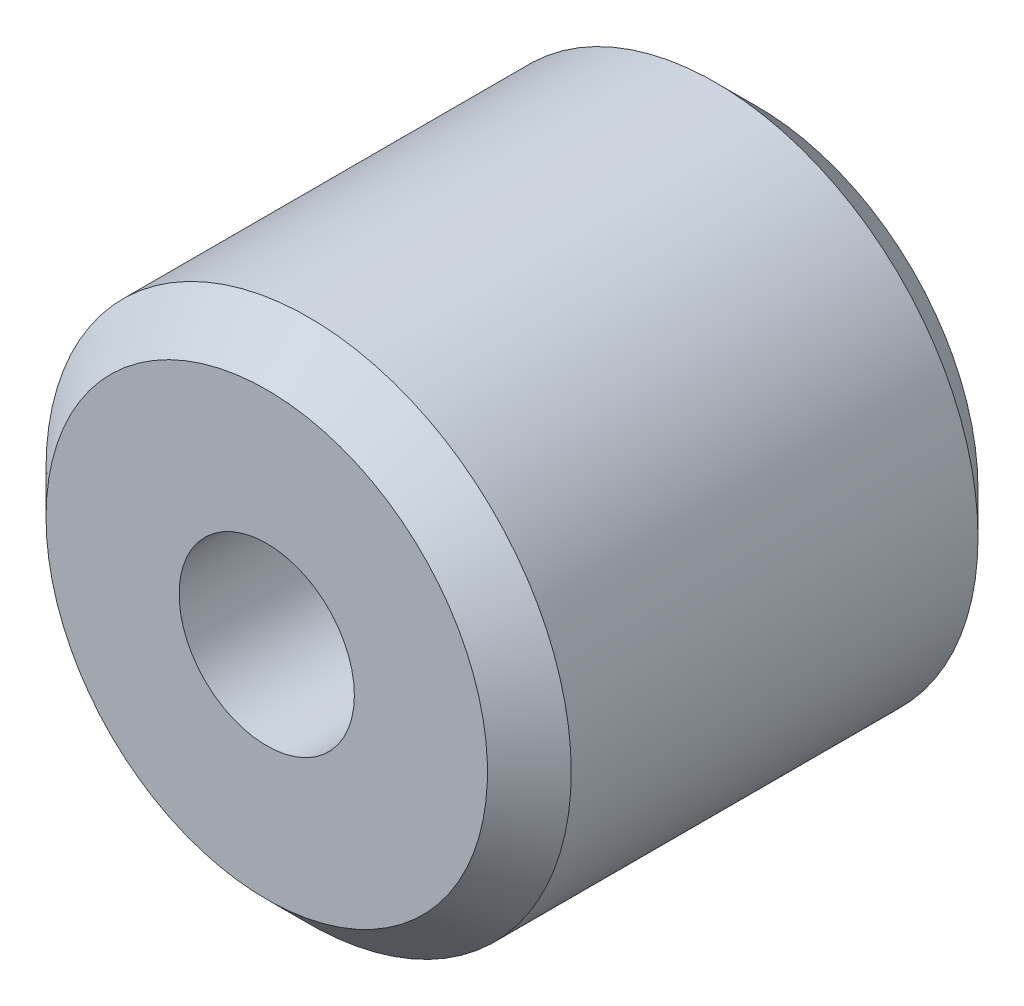
ISO-10303-21;
HEADER;
FILE_DESCRIPTION(('STEP AP214'),'2;1');
FILE_NAME('part.step','',(''),(''),'','','');
FILE_SCHEMA(('AUTOMOTIVE_DESIGN { 1 0 10303 214 1 1 1 1 }'));
ENDSEC;
DATA;
#1=APPLICATION_CONTEXT('core data for automotive mechanical design processes');
#2=APPLICATION_PROTOCOL_DEFINITION('international standard','automotive_design',2000,#1);
#3=PRODUCT_CONTEXT('',#1,'mechanical');
#4=PRODUCT('Part','Part','',(#3));
#5=PRODUCT_RELATED_PRODUCT_CATEGORY('part','',(#4));
#6=PRODUCT_DEFINITION_FORMATION('','',#4);
#7=PRODUCT_DEFINITION_CONTEXT('part definition',#1,'design');
#8=PRODUCT_DEFINITION('design','',#6,#7);
#9=PRODUCT_DEFINITION_SHAPE('','',#8);
#10=(LENGTH_UNIT() NAMED_UNIT(*) SI_UNIT(.MILLI.,.METRE.));
#11=(NAMED_UNIT(*) PLANE_ANGLE_UNIT() SI_UNIT($,.RADIAN.));
#12=(NAMED_UNIT(*) SI_UNIT($,.STERADIAN.) SOLID_ANGLE_UNIT());
#13=UNCERTAINTY_MEASURE_WITH_UNIT(LENGTH_MEASURE(1.E-05),#10,'distance_accuracy_value','');
#14=(GEOMETRIC_REPRESENTATION_CONTEXT(3) GLOBAL_UNCERTAINTY_ASSIGNED_CONTEXT((#13)) GLOBAL_UNIT_ASSIGNED_CONTEXT((#10,
#11,#12)) REPRESENTATION_CONTEXT('',''));
#15=CARTESIAN_POINT('',(0.,0.,0.));
#16=DIRECTION('',(0.,0.,1.));
#17=DIRECTION('',(1.,0.,0.));
#18=AXIS2_PLACEMENT_3D('',#15,#16,#17);
#19=CARTESIAN_POINT('',(0.,0.,4.45));
#20=DIRECTION('',(0.,0.,1.));
#21=DIRECTION('',(1.,0.,0.));
#22=AXIS2_PLACEMENT_3D('',#19,#20,#21);
#23=PLANE('',#22);
#24=CARTESIAN_POINT('',(0.,0.,4.45));
#25=DIRECTION('',(0.,0.,1.));
#26=DIRECTION('',(1.,0.,0.));
#27=AXIS2_PLACEMENT_3D('',#24,#25,#26);
#28=CIRCLE('',#27,4.005);
#29=CARTESIAN_POINT('',(-4.005,0.,4.45));
#30=VERTEX_POINT('',#29);
#31=EDGE_CURVE('E10',#30,#30,#28,.T.);
#32=ORIENTED_EDGE('',*,*,#31,.T.);
#33=EDGE_LOOP('',(#32));
#34=FACE_BOUND('',#33,.T.);
#35=CARTESIAN_POINT('',(0.,0.,4.45));
#36=DIRECTION('',(0.,0.,1.));
#37=DIRECTION('',(1.,0.,0.));
#38=AXIS2_PLACEMENT_3D('',#35,#36,#37);
#39=CIRCLE('',#38,1.59);
#40=CARTESIAN_POINT('',(1.59,0.,4.45));
#41=VERTEX_POINT('',#40);
#42=EDGE_CURVE('E54',#41,#41,#39,.T.);
#43=ORIENTED_EDGE('',*,*,#42,.F.);
#44=EDGE_LOOP('',(#43));
#45=FACE_BOUND('',#44,.T.);
#46=ADVANCED_FACE('F33',(#34,#45),#23,.T.);
#47=CARTESIAN_POINT('',(0.,0.,-4.45));
#48=DIRECTION('',(0.,0.,1.));
#49=DIRECTION('',(1.,0.,0.));
#50=AXIS2_PLACEMENT_3D('',#47,#48,#49);
#51=PLANE('',#50);
#52=CARTESIAN_POINT('',(0.,0.,-4.45));
#53=DIRECTION('',(0.,0.,1.));
#54=DIRECTION('',(1.,0.,0.));
#55=AXIS2_PLACEMENT_3D('',#52,#53,#54);
#56=CIRCLE('',#55,4.00499999999999);
#57=CARTESIAN_POINT('',(4.00499999999999,0.,-4.45));
#58=VERTEX_POINT('',#57);
#59=EDGE_CURVE('E41',#58,#58,#56,.F.);
#60=ORIENTED_EDGE('',*,*,#59,.T.);
#61=EDGE_LOOP('',(#60));
#62=FACE_BOUND('',#61,.T.);
#63=CARTESIAN_POINT('',(0.,0.,-4.45));
#64=DIRECTION('',(0.,0.,1.));
#65=DIRECTION('',(1.,0.,0.));
#66=AXIS2_PLACEMENT_3D('',#63,#64,#65);
#67=CIRCLE('',#66,1.59);
#68=CARTESIAN_POINT('',(1.59,0.,-4.45));
#69=VERTEX_POINT('',#68);
#70=EDGE_CURVE('E55',#69,#69,#67,.T.);
#71=ORIENTED_EDGE('',*,*,#70,.T.);
#72=EDGE_LOOP('',(#71));
#73=FACE_BOUND('',#72,.T.);
#74=ADVANCED_FACE('F65',(#62,#73),#51,.F.);
#75=CARTESIAN_POINT('',(0.,0.,4.45));
#76=DIRECTION('',(0.,0.,-1.));
#77=DIRECTION('',(-1.,0.,0.));
#78=AXIS2_PLACEMENT_3D('',#75,#76,#77);
#79=CYLINDRICAL_SURFACE('',#78,4.765);
#80=CARTESIAN_POINT('',(0.,0.,-3.69));
#81=DIRECTION('',(0.,0.,1.));
#82=DIRECTION('',(1.,0.,0.));
#83=AXIS2_PLACEMENT_3D('',#80,#81,#82);
#84=CIRCLE('',#83,4.765);
#85=CARTESIAN_POINT('',(-4.765,0.,-3.69));
#86=VERTEX_POINT('',#85);
#87=EDGE_CURVE('E45',#86,#86,#84,.T.);
#88=CARTESIAN_POINT('',(0.,0.,3.69));
#89=DIRECTION('',(0.,0.,1.));
#90=DIRECTION('',(1.,0.,0.));
#91=AXIS2_PLACEMENT_3D('',#88,#89,#90);
#92=CIRCLE('',#91,4.765);
#93=CARTESIAN_POINT('',(-4.765,0.,3.69));
#94=VERTEX_POINT('',#93);
#95=EDGE_CURVE('E49',#94,#94,#92,.F.);
#96=CARTESIAN_POINT('',(-4.765,0.,-3.69));
#97=CARTESIAN_POINT('',(-4.765,0.,-3.613125));
#98=CARTESIAN_POINT('',(-4.765,0.,-3.53625));
#99=CARTESIAN_POINT('',(-4.765,0.,-3.3825));
#100=CARTESIAN_POINT('',(-4.765,0.,-3.305625));
#101=CARTESIAN_POINT('',(-4.765,0.,-3.151875));
#102=CARTESIAN_POINT('',(-4.765,0.,-3.075));
#103=CARTESIAN_POINT('',(-4.765,0.,-2.92125));
#104=CARTESIAN_POINT('',(-4.765,0.,-2.844375));
#105=CARTESIAN_POINT('',(-4.765,0.,-2.690625));
#106=CARTESIAN_POINT('',(-4.765,0.,-2.61375));
#107=CARTESIAN_POINT('',(-4.765,0.,-2.46));
#108=CARTESIAN_POINT('',(-4.765,0.,-2.383125));
#109=CARTESIAN_POINT('',(-4.765,0.,-2.229375));
#110=CARTESIAN_POINT('',(-4.765,0.,-2.1525));
#111=CARTESIAN_POINT('',(-4.765,0.,-1.99875));
#112=CARTESIAN_POINT('',(-4.765,0.,-1.921875));
#113=CARTESIAN_POINT('',(-4.765,0.,-1.768125));
#114=CARTESIAN_POINT('',(-4.765,0.,-1.69125));
#115=CARTESIAN_POINT('',(-4.765,0.,-1.5375));
#116=CARTESIAN_POINT('',(-4.765,0.,-1.460625));
#117=CARTESIAN_POINT('',(-4.765,0.,-1.306875));
#118=CARTESIAN_POINT('',(-4.765,0.,-1.23));
#119=CARTESIAN_POINT('',(-4.765,0.,-1.07625));
#120=CARTESIAN_POINT('',(-4.765,0.,-0.999374999999999));
#121=CARTESIAN_POINT('',(-4.765,0.,-0.845625));
#122=CARTESIAN_POINT('',(-4.765,0.,-0.76875));
#123=CARTESIAN_POINT('',(-4.765,0.,-0.615));
#124=CARTESIAN_POINT('',(-4.765,0.,-0.538125));
#125=CARTESIAN_POINT('',(-4.765,0.,-0.384375));
#126=CARTESIAN_POINT('',(-4.765,0.,-0.3075));
#127=CARTESIAN_POINT('',(-4.765,0.,-0.15375));
#128=CARTESIAN_POINT('',(-4.765,0.,-0.076875));
#129=CARTESIAN_POINT('',(-4.765,0.,0.076875));
#130=CARTESIAN_POINT('',(-4.765,0.,0.15375));
#131=CARTESIAN_POINT('',(-4.765,0.,0.3075));
#132=CARTESIAN_POINT('',(-4.765,0.,0.384375));
#133=CARTESIAN_POINT('',(-4.765,0.,0.538125));
#134=CARTESIAN_POINT('',(-4.765,0.,0.615));
#135=CARTESIAN_POINT('',(-4.765,0.,0.76875));
#136=CARTESIAN_POINT('',(-4.765,0.,0.845625));
#137=CARTESIAN_POINT('',(-4.765,0.,0.999375));
#138=CARTESIAN_POINT('',(-4.765,0.,1.07625));
#139=CARTESIAN_POINT('',(-4.765,0.,1.23));
#140=CARTESIAN_POINT('',(-4.765,0.,1.306875));
#141=CARTESIAN_POINT('',(-4.765,0.,1.460625));
#142=CARTESIAN_POINT('',(-4.765,0.,1.5375));
#143=CARTESIAN_POINT('',(-4.765,0.,1.69125));
#144=CARTESIAN_POINT('',(-4.765,0.,1.768125));
#145=CARTESIAN_POINT('',(-4.765,0.,1.921875));
#146=CARTESIAN_POINT('',(-4.765,0.,1.99875));
#147=CARTESIAN_POINT('',(-4.765,0.,2.1525));
#148=CARTESIAN_POINT('',(-4.765,0.,2.229375));
#149=CARTESIAN_POINT('',(-4.765,0.,2.383125));
#150=CARTESIAN_POINT('',(-4.765,0.,2.46));
#151=CARTESIAN_POINT('',(-4.765,0.,2.61375));
#152=CARTESIAN_POINT('',(-4.765,0.,2.690625));
#153=CARTESIAN_POINT('',(-4.765,0.,2.844375));
#154=CARTESIAN_POINT('',(-4.765,0.,2.92125));
#155=CARTESIAN_POINT('',(-4.765,0.,3.075));
#156=CARTESIAN_POINT('',(-4.765,0.,3.151875));
#157=CARTESIAN_POINT('',(-4.765,0.,3.305625));
#158=CARTESIAN_POINT('',(-4.765,0.,3.3825));
#159=CARTESIAN_POINT('',(-4.765,0.,3.53625));
#160=CARTESIAN_POINT('',(-4.765,0.,3.613125));
#161=CARTESIAN_POINT('',(-4.765,0.,3.69));
#162=B_SPLINE_CURVE_WITH_KNOTS('',3,(#96,#97,#98,#99,#100,#101,#102,#103,#104,#105,#106,#107,
#108,#109,#110,#111,#112,#113,#114,#115,#116,#117,#118,#119,#120,#121,#122,#123,#124,#125,#126,
#127,#128,#129,#130,#131,#132,#133,#134,#135,#136,#137,#138,#139,#140,#141,#142,#143,#144,#145,
#146,#147,#148,#149,#150,#151,#152,#153,#154,#155,#156,#157,#158,#159,#160,#161),.UNSPECIFIED.,
.F.,.F.,(4,2,2,2,2,2,2,2,2,2,2,2,2,2,2,2,2,2,2,2,2,2,2,2,2,2,2,2,2,2,2,2,4),(0.,0.230625,
0.46125,0.691875,0.9225,1.153125,1.38375,1.614375,1.845,2.075625,2.30625,2.536875,2.7675,
2.998125,3.22875,3.459375,3.69,3.920625,4.15125,4.381875,4.6125,4.843125,5.07375,5.304375,5.535,
5.765625,5.99625,6.226875,6.4575,6.688125,6.91875,7.149375,7.38),.UNSPECIFIED.);
#163=EDGE_CURVE('BSEAM70',#86,#94,#162,.T.);
#164=ORIENTED_EDGE('',*,*,#87,.T.);
#165=ORIENTED_EDGE('',*,*,#95,.T.);
#166=ORIENTED_EDGE('',*,*,#163,.T.);
#167=ORIENTED_EDGE('',*,*,#163,.F.);
#168=EDGE_LOOP('',(#164,#166,#165,#167));
#169=FACE_BOUND('',#168,.T.);
#170=ADVANCED_FACE('F70',(#169),#79,.T.);
#171=CARTESIAN_POINT('',(0.,0.,4.45));
#172=DIRECTION('',(0.,0.,-1.));
#173=DIRECTION('',(-1.,0.,0.));
#174=AXIS2_PLACEMENT_3D('',#171,#172,#173);
#175=CYLINDRICAL_SURFACE('',#174,1.59);
#176=ORIENTED_EDGE('',*,*,#42,.T.);
#177=EDGE_LOOP('',(#176));
#178=FACE_BOUND('',#177,.T.);
#179=ORIENTED_EDGE('',*,*,#70,.F.);
#180=EDGE_LOOP('',(#179));
#181=FACE_BOUND('',#180,.T.);
#182=ADVANCED_FACE('F61',(#178,#181),#175,.F.);
#183=CARTESIAN_POINT('',(0.,0.,-3.69));
#184=DIRECTION('',(0.,0.,1.));
#185=DIRECTION('',(1.,0.,0.));
#186=AXIS2_PLACEMENT_3D('',#183,#184,#185);
#187=CONICAL_SURFACE('',#186,4.765,0.785398163397451);
#188=ORIENTED_EDGE('',*,*,#59,.F.);
#189=EDGE_LOOP('',(#188));
#190=FACE_BOUND('',#189,.T.);
#191=ORIENTED_EDGE('',*,*,#87,.F.);
#192=EDGE_LOOP('',(#191));
#193=FACE_BOUND('',#192,.T.);
#194=ADVANCED_FACE('F77',(#190,#193),#187,.T.);
#195=CARTESIAN_POINT('',(0.,0.,4.45));
#196=DIRECTION('',(0.,0.,-1.));
#197=DIRECTION('',(-1.,0.,0.));
#198=AXIS2_PLACEMENT_3D('',#195,#196,#197);
#199=CONICAL_SURFACE('',#198,4.005,0.785398163397447);
#200=CARTESIAN_POINT('',(-4.765,0.,3.69));
#201=CARTESIAN_POINT('',(-4.75708333333333,0.,3.69791666666666));
#202=CARTESIAN_POINT('',(-4.74916666666667,0.,3.70583333333333));
#203=CARTESIAN_POINT('',(-4.73333333333333,0.,3.72166666666666));
#204=CARTESIAN_POINT('',(-4.72541666666667,0.,3.72958333333333));
#205=CARTESIAN_POINT('',(-4.70958333333333,0.,3.74541666666666));
#206=CARTESIAN_POINT('',(-4.70166666666667,0.,3.75333333333333));
#207=CARTESIAN_POINT('',(-4.68583333333333,0.,3.76916666666666));
#208=CARTESIAN_POINT('',(-4.67791666666667,0.,3.77708333333333));
#209=CARTESIAN_POINT('',(-4.66208333333333,0.,3.79291666666666));
#210=CARTESIAN_POINT('',(-4.65416666666667,0.,3.80083333333333));
#211=CARTESIAN_POINT('',(-4.63833333333333,0.,3.81666666666666));
#212=CARTESIAN_POINT('',(-4.63041666666667,0.,3.82458333333333));
#213=CARTESIAN_POINT('',(-4.61458333333333,0.,3.84041666666667));
#214=CARTESIAN_POINT('',(-4.60666666666667,0.,3.84833333333333));
#215=CARTESIAN_POINT('',(-4.59083333333333,0.,3.86416666666666));
#216=CARTESIAN_POINT('',(-4.58291666666667,0.,3.87208333333333));
#217=CARTESIAN_POINT('',(-4.56708333333333,0.,3.88791666666667));
#218=CARTESIAN_POINT('',(-4.55916666666667,0.,3.89583333333333));
#219=CARTESIAN_POINT('',(-4.54333333333333,0.,3.91166666666666));
#220=CARTESIAN_POINT('',(-4.53541666666666,0.,3.91958333333333));
#221=CARTESIAN_POINT('',(-4.51958333333333,0.,3.93541666666667));
#222=CARTESIAN_POINT('',(-4.51166666666667,0.,3.94333333333333));
#223=CARTESIAN_POINT('',(-4.49583333333333,0.,3.95916666666666));
#224=CARTESIAN_POINT('',(-4.48791666666667,0.,3.96708333333333));
#225=CARTESIAN_POINT('',(-4.47208333333333,0.,3.98291666666666));
#226=CARTESIAN_POINT('',(-4.46416666666666,0.,3.99083333333333));
#227=CARTESIAN_POINT('',(-4.44833333333333,0.,4.00666666666667));
#228=CARTESIAN_POINT('',(-4.44041666666667,0.,4.01458333333333));
#229=CARTESIAN_POINT('',(-4.42458333333333,0.,4.03041666666666));
#230=CARTESIAN_POINT('',(-4.41666666666667,0.,4.03833333333333));
#231=CARTESIAN_POINT('',(-4.40083333333333,0.,4.05416666666667));
#232=CARTESIAN_POINT('',(-4.39291666666666,0.,4.06208333333333));
#233=CARTESIAN_POINT('',(-4.37708333333333,0.,4.07791666666667));
#234=CARTESIAN_POINT('',(-4.36916666666666,0.,4.08583333333333));
#235=CARTESIAN_POINT('',(-4.35333333333333,0.,4.10166666666666));
#236=CARTESIAN_POINT('',(-4.34541666666667,0.,4.10958333333333));
#237=CARTESIAN_POINT('',(-4.32958333333333,0.,4.12541666666667));
#238=CARTESIAN_POINT('',(-4.32166666666667,0.,4.13333333333333));
#239=CARTESIAN_POINT('',(-4.30583333333333,0.,4.14916666666667));
#240=CARTESIAN_POINT('',(-4.29791666666666,0.,4.15708333333333));
#241=CARTESIAN_POINT('',(-4.28208333333333,0.,4.17291666666666));
#242=CARTESIAN_POINT('',(-4.27416666666667,0.,4.18083333333333));
#243=CARTESIAN_POINT('',(-4.25833333333333,0.,4.19666666666667));
#244=CARTESIAN_POINT('',(-4.25041666666667,0.,4.20458333333333));
#245=CARTESIAN_POINT('',(-4.23458333333333,0.,4.22041666666667));
#246=CARTESIAN_POINT('',(-4.22666666666666,0.,4.22833333333333));
#247=CARTESIAN_POINT('',(-4.21083333333333,0.,4.24416666666666));
#248=CARTESIAN_POINT('',(-4.20291666666667,0.,4.25208333333333));
#249=CARTESIAN_POINT('',(-4.18708333333333,0.,4.26791666666667));
#250=CARTESIAN_POINT('',(-4.17916666666667,0.,4.27583333333333));
#251=CARTESIAN_POINT('',(-4.16333333333333,0.,4.29166666666667));
#252=CARTESIAN_POINT('',(-4.15541666666666,0.,4.29958333333333));
#253=CARTESIAN_POINT('',(-4.13958333333333,0.,4.31541666666666));
#254=CARTESIAN_POINT('',(-4.13166666666667,0.,4.32333333333333));
#255=CARTESIAN_POINT('',(-4.11583333333333,0.,4.33916666666667));
#256=CARTESIAN_POINT('',(-4.10791666666667,0.,4.34708333333333));
#257=CARTESIAN_POINT('',(-4.09208333333333,0.,4.36291666666667));
#258=CARTESIAN_POINT('',(-4.08416666666666,0.,4.37083333333333));
#259=CARTESIAN_POINT('',(-4.06833333333333,0.,4.38666666666667));
#260=CARTESIAN_POINT('',(-4.06041666666667,0.,4.39458333333333));
#261=CARTESIAN_POINT('',(-4.04458333333333,0.,4.41041666666667));
#262=CARTESIAN_POINT('',(-4.03666666666667,0.,4.41833333333333));
#263=CARTESIAN_POINT('',(-4.02083333333333,0.,4.43416666666667));
#264=CARTESIAN_POINT('',(-4.01291666666666,0.,4.44208333333333));
#265=CARTESIAN_POINT('',(-4.005,0.,4.45));
#266=B_SPLINE_CURVE_WITH_KNOTS('',3,(#200,#201,#202,#203,#204,#205,#206,#207,#208,#209,#210,
#211,#212,#213,#214,#215,#216,#217,#218,#219,#220,#221,#222,#223,#224,#225,#226,#227,#228,#229,
#230,#231,#232,#233,#234,#235,#236,#237,#238,#239,#240,#241,#242,#243,#244,#245,#246,#247,#248,
#249,#250,#251,#252,#253,#254,#255,#256,#257,#258,#259,#260,#261,#262,#263,#264,#265),
.UNSPECIFIED.,.F.,.F.,(4,2,2,2,2,2,2,2,2,2,2,2,2,2,2,2,2,2,2,2,2,2,2,2,2,2,2,2,2,2,2,2,4),(0.,
0.0335875721063609,0.067175144212722,0.100762716319083,0.134350288425444,0.167937860531805,
0.201525432638166,0.235113004744527,0.268700576850888,0.302288148957249,0.335875721063611,
0.369463293169971,0.403050865276333,0.436638437382694,0.470226009489054,0.503813581595416,
0.537401153701777,0.570988725808138,0.604576297914499,0.63816387002086,0.671751442127221,
0.705339014233582,0.738926586339943,0.772514158446304,0.806101730552665,0.839689302659026,
0.873276874765387,0.906864446871748,0.940452018978109,0.974039591084471,1.00762716319083,
1.04121473529719,1.07480230740355),.UNSPECIFIED.);
#267=EDGE_CURVE('BSEAM36',#94,#30,#266,.T.);
#268=ORIENTED_EDGE('',*,*,#95,.F.);
#269=ORIENTED_EDGE('',*,*,#31,.F.);
#270=ORIENTED_EDGE('',*,*,#267,.T.);
#271=ORIENTED_EDGE('',*,*,#267,.F.);
#272=EDGE_LOOP('',(#268,#270,#269,#271));
#273=FACE_BOUND('',#272,.T.);
#274=ADVANCED_FACE('F36',(#273),#199,.T.);
#275=CLOSED_SHELL('',(#46,#74,#170,#182,#194,#274));
#276=MANIFOLD_SOLID_BREP('B2',#275);
#277=ADVANCED_BREP_SHAPE_REPRESENTATION('',(#18,#276),#14);
#278=SHAPE_DEFINITION_REPRESENTATION(#9,#277);
ENDSEC;
END-ISO-10303-21;
